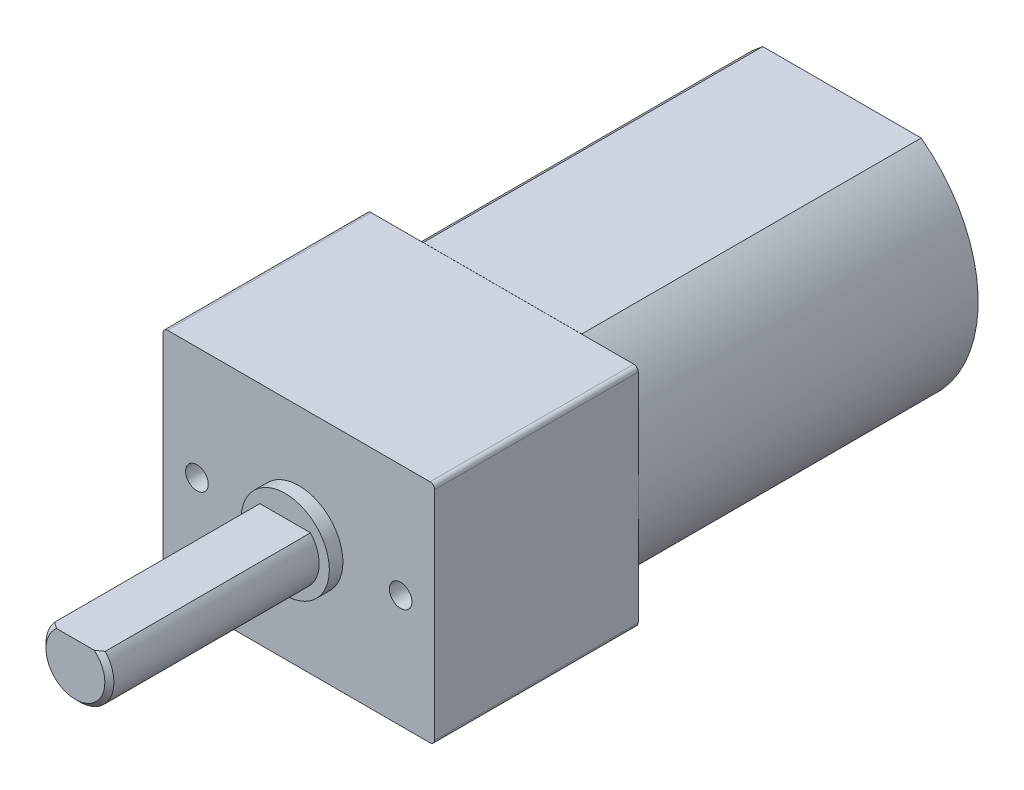
ISO-10303-21;
HEADER;
FILE_DESCRIPTION(('STEP AP214'),'2;1');
FILE_NAME('part.step','',(''),(''),'','','');
FILE_SCHEMA(('AUTOMOTIVE_DESIGN { 1 0 10303 214 1 1 1 1 }'));
ENDSEC;
DATA;
#1=APPLICATION_CONTEXT('core data for automotive mechanical design processes');
#2=APPLICATION_PROTOCOL_DEFINITION('international standard','automotive_design',2000,#1);
#3=PRODUCT_CONTEXT('',#1,'mechanical');
#4=PRODUCT('Part','Part','',(#3));
#5=PRODUCT_RELATED_PRODUCT_CATEGORY('part','',(#4));
#6=PRODUCT_DEFINITION_FORMATION('','',#4);
#7=PRODUCT_DEFINITION_CONTEXT('part definition',#1,'design');
#8=PRODUCT_DEFINITION('design','',#6,#7);
#9=PRODUCT_DEFINITION_SHAPE('','',#8);
#10=(LENGTH_UNIT() NAMED_UNIT(*) SI_UNIT(.MILLI.,.METRE.));
#11=(NAMED_UNIT(*) PLANE_ANGLE_UNIT() SI_UNIT($,.RADIAN.));
#12=(NAMED_UNIT(*) SI_UNIT($,.STERADIAN.) SOLID_ANGLE_UNIT());
#13=UNCERTAINTY_MEASURE_WITH_UNIT(LENGTH_MEASURE(1.E-05),#10,'distance_accuracy_value','');
#14=(GEOMETRIC_REPRESENTATION_CONTEXT(3) GLOBAL_UNCERTAINTY_ASSIGNED_CONTEXT((#13)) GLOBAL_UNIT_ASSIGNED_CONTEXT((#10,
#11,#12)) REPRESENTATION_CONTEXT('',''));
#15=CARTESIAN_POINT('',(0.,0.,0.));
#16=DIRECTION('',(0.,0.,1.));
#17=DIRECTION('',(1.,0.,0.));
#18=AXIS2_PLACEMENT_3D('',#15,#16,#17);
#19=CARTESIAN_POINT('',(-0.202155174491927,0.,15.));
#20=DIRECTION('',(0.,0.,-1.));
#21=DIRECTION('',(-1.,0.,0.));
#22=AXIS2_PLACEMENT_3D('',#19,#20,#21);
#23=PLANE('',#22);
#24=DIRECTION('',(0.,1.,0.));
#25=VECTOR('',#24,1.);
#26=CARTESIAN_POINT('',(6.,-4.995,15.));
#27=LINE('',#26,#25);
#28=CARTESIAN_POINT('',(6.,-0.489105436015966,15.));
#29=VERTEX_POINT('',#28);
#30=CARTESIAN_POINT('',(6.,0.489105436015966,15.));
#31=VERTEX_POINT('',#30);
#32=EDGE_CURVE('E234',#29,#31,#27,.T.);
#33=ORIENTED_EDGE('',*,*,#32,.F.);
#34=CARTESIAN_POINT('',(-0.202155174491927,0.,15.));
#35=DIRECTION('',(0.,0.,1.));
#36=DIRECTION('',(-1.,0.,0.));
#37=AXIS2_PLACEMENT_3D('',#34,#35,#36);
#38=CIRCLE('',#37,6.2214108477111);
#39=EDGE_CURVE('E499',#29,#31,#38,.T.);
#40=ORIENTED_EDGE('',*,*,#39,.T.);
#41=EDGE_LOOP('',(#33,#40));
#42=FACE_BOUND('',#41,.T.);
#43=ADVANCED_FACE('F51',(#42),#23,.F.);
#44=DIRECTION('',(1.,0.,0.));
#45=VECTOR('',#44,1.);
#46=CARTESIAN_POINT('',(-6.,-4.995,15.));
#47=LINE('',#46,#45);
#48=CARTESIAN_POINT('',(-3.50657267520119,-4.995,15.));
#49=VERTEX_POINT('',#48);
#50=CARTESIAN_POINT('',(3.50674330565246,-4.995,15.));
#51=VERTEX_POINT('',#50);
#52=EDGE_CURVE('E246',#49,#51,#47,.T.);
#53=ORIENTED_EDGE('',*,*,#52,.F.);
#54=CARTESIAN_POINT('',(0.298438110226455,0.,15.));
#55=DIRECTION('',(0.,0.,1.));
#56=DIRECTION('',(1.,0.,0.));
#57=AXIS2_PLACEMENT_3D('',#54,#55,#56);
#58=CIRCLE('',#57,6.27918243700728);
#59=CARTESIAN_POINT('',(-3.5,-5.,15.));
#60=VERTEX_POINT('',#59);
#61=EDGE_CURVE('E265',#49,#60,#58,.T.);
#62=ORIENTED_EDGE('',*,*,#61,.T.);
#63=DIRECTION('',(1.,0.,0.));
#64=VECTOR('',#63,1.);
#65=CARTESIAN_POINT('',(-3.5,-5.,15.));
#66=LINE('',#65,#64);
#67=CARTESIAN_POINT('',(3.5,-5.,15.));
#68=VERTEX_POINT('',#67);
#69=EDGE_CURVE('E269',#60,#68,#66,.T.);
#70=ORIENTED_EDGE('',*,*,#69,.T.);
#71=EDGE_CURVE('E256',#68,#51,#38,.T.);
#72=ORIENTED_EDGE('',*,*,#71,.T.);
#73=EDGE_LOOP('',(#53,#62,#70,#72));
#74=FACE_BOUND('',#73,.T.);
#75=ADVANCED_FACE('F419',(#74),#23,.F.);
#76=DIRECTION('',(-1.,0.,0.));
#77=VECTOR('',#76,1.);
#78=CARTESIAN_POINT('',(-6.,4.995,15.));
#79=LINE('',#78,#77);
#80=CARTESIAN_POINT('',(3.50674330565246,4.995,15.));
#81=VERTEX_POINT('',#80);
#82=CARTESIAN_POINT('',(-3.50657267520119,4.995,15.));
#83=VERTEX_POINT('',#82);
#84=EDGE_CURVE('E239',#81,#83,#79,.T.);
#85=ORIENTED_EDGE('',*,*,#84,.F.);
#86=CARTESIAN_POINT('',(3.5,5.,15.));
#87=VERTEX_POINT('',#86);
#88=EDGE_CURVE('E262',#81,#87,#38,.T.);
#89=ORIENTED_EDGE('',*,*,#88,.T.);
#90=DIRECTION('',(-1.,0.,0.));
#91=VECTOR('',#90,1.);
#92=CARTESIAN_POINT('',(-3.5,5.,15.));
#93=LINE('',#92,#91);
#94=CARTESIAN_POINT('',(-3.5,5.,15.));
#95=VERTEX_POINT('',#94);
#96=EDGE_CURVE('E260',#87,#95,#93,.T.);
#97=ORIENTED_EDGE('',*,*,#96,.T.);
#98=EDGE_CURVE('E266',#95,#83,#58,.T.);
#99=ORIENTED_EDGE('',*,*,#98,.T.);
#100=EDGE_LOOP('',(#85,#89,#97,#99));
#101=FACE_BOUND('',#100,.T.);
#102=ADVANCED_FACE('F421',(#101),#23,.F.);
#103=CARTESIAN_POINT('',(-0.202155174491927,0.,15.));
#104=DIRECTION('',(0.,0.,-1.));
#105=DIRECTION('',(-1.,0.,0.));
#106=AXIS2_PLACEMENT_3D('',#103,#104,#105);
#107=CYLINDRICAL_SURFACE('',#106,6.2214108477111);
#108=CARTESIAN_POINT('',(-0.202155174491927,0.,0.));
#109=DIRECTION('',(0.,0.,1.));
#110=DIRECTION('',(-1.,0.,0.));
#111=AXIS2_PLACEMENT_3D('',#108,#109,#110);
#112=CIRCLE('',#111,6.2214108477111);
#113=CARTESIAN_POINT('',(3.5,-5.,0.));
#114=VERTEX_POINT('',#113);
#115=CARTESIAN_POINT('',(3.5,5.,0.));
#116=VERTEX_POINT('',#115);
#117=EDGE_CURVE('E250',#114,#116,#112,.T.);
#118=ORIENTED_EDGE('',*,*,#117,.T.);
#119=DIRECTION('',(0.,0.,-1.));
#120=VECTOR('',#119,1.);
#121=CARTESIAN_POINT('',(3.5,5.,15.));
#122=LINE('',#121,#120);
#123=EDGE_CURVE('E255',#87,#116,#122,.T.);
#124=ORIENTED_EDGE('',*,*,#123,.F.);
#125=ORIENTED_EDGE('',*,*,#88,.F.);
#126=EDGE_CURVE('E497',#31,#81,#38,.T.);
#127=ORIENTED_EDGE('',*,*,#126,.F.);
#128=ORIENTED_EDGE('',*,*,#39,.F.);
#129=EDGE_CURVE('E261',#51,#29,#38,.T.);
#130=ORIENTED_EDGE('',*,*,#129,.F.);
#131=ORIENTED_EDGE('',*,*,#71,.F.);
#132=DIRECTION('',(0.,0.,-1.));
#133=VECTOR('',#132,1.);
#134=CARTESIAN_POINT('',(3.5,-5.,15.));
#135=LINE('',#134,#133);
#136=EDGE_CURVE('E273',#68,#114,#135,.T.);
#137=ORIENTED_EDGE('',*,*,#136,.T.);
#138=EDGE_LOOP('',(#118,#124,#125,#127,#128,#130,#131,#137));
#139=FACE_BOUND('',#138,.T.);
#140=ADVANCED_FACE('F436',(#139),#107,.T.);
#141=CARTESIAN_POINT('',(-3.5,5.,15.));
#142=DIRECTION('',(0.,-1.,0.));
#143=DIRECTION('',(0.,0.,-1.));
#144=AXIS2_PLACEMENT_3D('',#141,#142,#143);
#145=PLANE('',#144);
#146=DIRECTION('',(-1.,0.,0.));
#147=VECTOR('',#146,1.);
#148=CARTESIAN_POINT('',(-3.5,5.,0.));
#149=LINE('',#148,#147);
#150=CARTESIAN_POINT('',(-3.5,5.,0.));
#151=VERTEX_POINT('',#150);
#152=EDGE_CURVE('E277',#116,#151,#149,.T.);
#153=ORIENTED_EDGE('',*,*,#152,.T.);
#154=DIRECTION('',(0.,0.,-1.));
#155=VECTOR('',#154,1.);
#156=CARTESIAN_POINT('',(-3.5,5.,15.));
#157=LINE('',#156,#155);
#158=EDGE_CURVE('E293',#95,#151,#157,.T.);
#159=ORIENTED_EDGE('',*,*,#158,.F.);
#160=ORIENTED_EDGE('',*,*,#96,.F.);
#161=ORIENTED_EDGE('',*,*,#123,.T.);
#162=EDGE_LOOP('',(#153,#159,#160,#161));
#163=FACE_BOUND('',#162,.T.);
#164=ADVANCED_FACE('F432',(#163),#145,.F.);
#165=CARTESIAN_POINT('',(0.298438110226455,0.,15.));
#166=DIRECTION('',(0.,0.,-1.));
#167=DIRECTION('',(-1.,0.,0.));
#168=AXIS2_PLACEMENT_3D('',#165,#166,#167);
#169=CYLINDRICAL_SURFACE('',#168,6.27918243700728);
#170=CARTESIAN_POINT('',(0.298438110226455,0.,0.));
#171=DIRECTION('',(0.,0.,1.));
#172=DIRECTION('',(1.,0.,0.));
#173=AXIS2_PLACEMENT_3D('',#170,#171,#172);
#174=CIRCLE('',#173,6.27918243700728);
#175=CARTESIAN_POINT('',(-3.5,-5.,0.));
#176=VERTEX_POINT('',#175);
#177=EDGE_CURVE('E280',#151,#176,#174,.T.);
#178=ORIENTED_EDGE('',*,*,#177,.T.);
#179=DIRECTION('',(0.,0.,-1.));
#180=VECTOR('',#179,1.);
#181=CARTESIAN_POINT('',(-3.5,-5.,15.));
#182=LINE('',#181,#180);
#183=EDGE_CURVE('E289',#60,#176,#182,.T.);
#184=ORIENTED_EDGE('',*,*,#183,.F.);
#185=ORIENTED_EDGE('',*,*,#61,.F.);
#186=EDGE_CURVE('E270',#83,#49,#58,.T.);
#187=ORIENTED_EDGE('',*,*,#186,.F.);
#188=ORIENTED_EDGE('',*,*,#98,.F.);
#189=ORIENTED_EDGE('',*,*,#158,.T.);
#190=EDGE_LOOP('',(#178,#184,#185,#187,#188,#189));
#191=FACE_BOUND('',#190,.T.);
#192=ADVANCED_FACE('F428',(#191),#169,.T.);
#193=CARTESIAN_POINT('',(-3.5,-5.,15.));
#194=DIRECTION('',(0.,1.,0.));
#195=DIRECTION('',(0.,0.,1.));
#196=AXIS2_PLACEMENT_3D('',#193,#194,#195);
#197=PLANE('',#196);
#198=DIRECTION('',(1.,0.,0.));
#199=VECTOR('',#198,1.);
#200=CARTESIAN_POINT('',(-3.5,-5.,0.));
#201=LINE('',#200,#199);
#202=EDGE_CURVE('E283',#176,#114,#201,.T.);
#203=ORIENTED_EDGE('',*,*,#202,.T.);
#204=ORIENTED_EDGE('',*,*,#136,.F.);
#205=ORIENTED_EDGE('',*,*,#69,.F.);
#206=ORIENTED_EDGE('',*,*,#183,.T.);
#207=EDGE_LOOP('',(#203,#204,#205,#206));
#208=FACE_BOUND('',#207,.T.);
#209=ADVANCED_FACE('F424',(#208),#197,.F.);
#210=CARTESIAN_POINT('',(-0.202155174491927,0.,0.));
#211=DIRECTION('',(0.,0.,-1.));
#212=DIRECTION('',(-1.,0.,0.));
#213=AXIS2_PLACEMENT_3D('',#210,#211,#212);
#214=PLANE('',#213);
#215=CARTESIAN_POINT('',(0.,0.,0.));
#216=DIRECTION('',(0.,0.,-1.));
#217=DIRECTION('',(-1.,0.,0.));
#218=AXIS2_PLACEMENT_3D('',#215,#216,#217);
#219=CIRCLE('',#218,2.5);
#220=CARTESIAN_POINT('',(-2.5,0.,0.));
#221=VERTEX_POINT('',#220);
#222=EDGE_CURVE('E251',#221,#221,#219,.T.);
#223=ORIENTED_EDGE('',*,*,#222,.F.);
#224=EDGE_LOOP('',(#223));
#225=FACE_BOUND('',#224,.T.);
#226=ORIENTED_EDGE('',*,*,#117,.F.);
#227=ORIENTED_EDGE('',*,*,#202,.F.);
#228=ORIENTED_EDGE('',*,*,#177,.F.);
#229=ORIENTED_EDGE('',*,*,#152,.F.);
#230=EDGE_LOOP('',(#226,#227,#228,#229));
#231=FACE_BOUND('',#230,.T.);
#232=ADVANCED_FACE('F415',(#225,#231),#214,.T.);
#233=CARTESIAN_POINT('',(0.,0.,-1.));
#234=DIRECTION('',(0.,0.,1.));
#235=DIRECTION('',(1.,0.,0.));
#236=AXIS2_PLACEMENT_3D('',#233,#234,#235);
#237=CYLINDRICAL_SURFACE('',#236,2.5);
#238=CARTESIAN_POINT('',(0.,0.,-1.));
#239=DIRECTION('',(0.,0.,-1.));
#240=DIRECTION('',(-1.,0.,0.));
#241=AXIS2_PLACEMENT_3D('',#238,#239,#240);
#242=CIRCLE('',#241,2.5);
#243=CARTESIAN_POINT('',(-2.5,0.,-1.));
#244=VERTEX_POINT('',#243);
#245=EDGE_CURVE('E229',#244,#244,#242,.T.);
#246=ORIENTED_EDGE('',*,*,#245,.F.);
#247=EDGE_LOOP('',(#246));
#248=FACE_BOUND('',#247,.T.);
#249=ORIENTED_EDGE('',*,*,#222,.T.);
#250=EDGE_LOOP('',(#249));
#251=FACE_BOUND('',#250,.T.);
#252=ADVANCED_FACE('F411',(#248,#251),#237,.T.);
#253=CARTESIAN_POINT('',(0.,0.,-1.));
#254=DIRECTION('',(0.,0.,-1.));
#255=DIRECTION('',(-1.,0.,0.));
#256=AXIS2_PLACEMENT_3D('',#253,#254,#255);
#257=PLANE('',#256);
#258=ORIENTED_EDGE('',*,*,#245,.T.);
#259=EDGE_LOOP('',(#258));
#260=FACE_BOUND('',#259,.T.);
#261=ADVANCED_FACE('F408',(#260),#257,.T.);
#262=CARTESIAN_POINT('',(0.,0.,15.));
#263=DIRECTION('',(0.,0.,-1.));
#264=DIRECTION('',(-1.,0.,0.));
#265=AXIS2_PLACEMENT_3D('',#262,#263,#264);
#266=PLANE('',#265);
#267=CARTESIAN_POINT('',(6.,-4.795,15.));
#268=VERTEX_POINT('',#267);
#269=EDGE_CURVE('E230',#268,#29,#27,.T.);
#270=ORIENTED_EDGE('',*,*,#269,.F.);
#271=CARTESIAN_POINT('',(5.8,-4.795,15.));
#272=DIRECTION('',(0.,0.,-1.));
#273=DIRECTION('',(-1.,0.,0.));
#274=AXIS2_PLACEMENT_3D('',#271,#272,#273);
#275=CIRCLE('',#274,0.2);
#276=CARTESIAN_POINT('',(5.8,-4.995,15.));
#277=VERTEX_POINT('',#276);
#278=EDGE_CURVE('E307',#268,#277,#275,.T.);
#279=ORIENTED_EDGE('',*,*,#278,.T.);
#280=EDGE_CURVE('E243',#51,#277,#47,.T.);
#281=ORIENTED_EDGE('',*,*,#280,.F.);
#282=ORIENTED_EDGE('',*,*,#129,.T.);
#283=EDGE_LOOP('',(#270,#279,#281,#282));
#284=FACE_BOUND('',#283,.T.);
#285=ADVANCED_FACE('F391',(#284),#266,.T.);
#286=CARTESIAN_POINT('',(5.8,4.995,15.));
#287=VERTEX_POINT('',#286);
#288=EDGE_CURVE('E235',#287,#81,#79,.T.);
#289=ORIENTED_EDGE('',*,*,#288,.F.);
#290=CARTESIAN_POINT('',(5.8,4.795,15.));
#291=DIRECTION('',(0.,0.,-1.));
#292=DIRECTION('',(-1.,0.,0.));
#293=AXIS2_PLACEMENT_3D('',#290,#291,#292);
#294=CIRCLE('',#293,0.2);
#295=CARTESIAN_POINT('',(6.,4.795,15.));
#296=VERTEX_POINT('',#295);
#297=EDGE_CURVE('E211',#287,#296,#294,.T.);
#298=ORIENTED_EDGE('',*,*,#297,.T.);
#299=EDGE_CURVE('E205',#31,#296,#27,.T.);
#300=ORIENTED_EDGE('',*,*,#299,.F.);
#301=ORIENTED_EDGE('',*,*,#126,.T.);
#302=EDGE_LOOP('',(#289,#298,#300,#301));
#303=FACE_BOUND('',#302,.T.);
#304=ADVANCED_FACE('F392',(#303),#266,.T.);
#305=CARTESIAN_POINT('',(6.,-4.995,24.));
#306=DIRECTION('',(-1.,0.,0.));
#307=DIRECTION('',(0.,0.,1.));
#308=AXIS2_PLACEMENT_3D('',#305,#306,#307);
#309=PLANE('',#308);
#310=DIRECTION('',(0.,1.,0.));
#311=VECTOR('',#310,1.);
#312=CARTESIAN_POINT('',(6.,-4.995,24.));
#313=LINE('',#312,#311);
#314=CARTESIAN_POINT('',(6.,-4.795,24.));
#315=VERTEX_POINT('',#314);
#316=CARTESIAN_POINT('',(6.,4.795,24.));
#317=VERTEX_POINT('',#316);
#318=EDGE_CURVE('E212',#315,#317,#313,.T.);
#319=ORIENTED_EDGE('',*,*,#318,.F.);
#320=DIRECTION('',(0.,0.,-1.));
#321=VECTOR('',#320,1.);
#322=CARTESIAN_POINT('',(6.,-4.795,24.));
#323=LINE('',#322,#321);
#324=EDGE_CURVE('E303',#315,#268,#323,.T.);
#325=ORIENTED_EDGE('',*,*,#324,.T.);
#326=ORIENTED_EDGE('',*,*,#269,.T.);
#327=ORIENTED_EDGE('',*,*,#32,.T.);
#328=ORIENTED_EDGE('',*,*,#299,.T.);
#329=DIRECTION('',(0.,0.,-1.));
#330=VECTOR('',#329,1.);
#331=CARTESIAN_POINT('',(6.,4.795,24.));
#332=LINE('',#331,#330);
#333=EDGE_CURVE('E300',#296,#317,#332,.F.);
#334=ORIENTED_EDGE('',*,*,#333,.T.);
#335=EDGE_LOOP('',(#319,#325,#326,#327,#328,#334));
#336=FACE_BOUND('',#335,.T.);
#337=ADVANCED_FACE('F403',(#336),#309,.F.);
#338=CARTESIAN_POINT('',(-6.,4.995,24.));
#339=DIRECTION('',(0.,-1.,0.));
#340=DIRECTION('',(0.,0.,-1.));
#341=AXIS2_PLACEMENT_3D('',#338,#339,#340);
#342=PLANE('',#341);
#343=CARTESIAN_POINT('',(-5.8,4.995,15.));
#344=VERTEX_POINT('',#343);
#345=EDGE_CURVE('E233',#83,#344,#79,.T.);
#346=ORIENTED_EDGE('',*,*,#345,.T.);
#347=DIRECTION('',(0.,0.,-1.));
#348=VECTOR('',#347,1.);
#349=CARTESIAN_POINT('',(-5.8,4.995,24.));
#350=LINE('',#349,#348);
#351=CARTESIAN_POINT('',(-5.8,4.995,24.));
#352=VERTEX_POINT('',#351);
#353=EDGE_CURVE('E346',#344,#352,#350,.F.);
#354=ORIENTED_EDGE('',*,*,#353,.T.);
#355=DIRECTION('',(-1.,0.,0.));
#356=VECTOR('',#355,1.);
#357=CARTESIAN_POINT('',(-6.,4.995,24.));
#358=LINE('',#357,#356);
#359=CARTESIAN_POINT('',(5.8,4.995,24.));
#360=VERTEX_POINT('',#359);
#361=EDGE_CURVE('E216',#360,#352,#358,.T.);
#362=ORIENTED_EDGE('',*,*,#361,.F.);
#363=DIRECTION('',(0.,0.,-1.));
#364=VECTOR('',#363,1.);
#365=CARTESIAN_POINT('',(5.8,4.995,24.));
#366=LINE('',#365,#364);
#367=EDGE_CURVE('E342',#360,#287,#366,.T.);
#368=ORIENTED_EDGE('',*,*,#367,.T.);
#369=ORIENTED_EDGE('',*,*,#288,.T.);
#370=ORIENTED_EDGE('',*,*,#84,.T.);
#371=EDGE_LOOP('',(#346,#354,#362,#368,#369,#370));
#372=FACE_BOUND('',#371,.T.);
#373=ADVANCED_FACE('F399',(#372),#342,.F.);
#374=CARTESIAN_POINT('',(-6.,-4.995,24.));
#375=DIRECTION('',(1.,0.,0.));
#376=DIRECTION('',(0.,0.,-1.));
#377=AXIS2_PLACEMENT_3D('',#374,#375,#376);
#378=PLANE('',#377);
#379=DIRECTION('',(0.,-1.,0.));
#380=VECTOR('',#379,1.);
#381=CARTESIAN_POINT('',(-6.,-4.995,15.));
#382=LINE('',#381,#380);
#383=CARTESIAN_POINT('',(-6.,4.795,15.));
#384=VERTEX_POINT('',#383);
#385=CARTESIAN_POINT('',(-6.,-4.795,15.));
#386=VERTEX_POINT('',#385);
#387=EDGE_CURVE('E238',#384,#386,#382,.T.);
#388=ORIENTED_EDGE('',*,*,#387,.T.);
#389=DIRECTION('',(0.,0.,-1.));
#390=VECTOR('',#389,1.);
#391=CARTESIAN_POINT('',(-6.,-4.795,24.));
#392=LINE('',#391,#390);
#393=CARTESIAN_POINT('',(-6.,-4.795,24.));
#394=VERTEX_POINT('',#393);
#395=EDGE_CURVE('E339',#386,#394,#392,.F.);
#396=ORIENTED_EDGE('',*,*,#395,.T.);
#397=DIRECTION('',(0.,-1.,0.));
#398=VECTOR('',#397,1.);
#399=CARTESIAN_POINT('',(-6.,-4.995,24.));
#400=LINE('',#399,#398);
#401=CARTESIAN_POINT('',(-6.,4.795,24.));
#402=VERTEX_POINT('',#401);
#403=EDGE_CURVE('E221',#402,#394,#400,.T.);
#404=ORIENTED_EDGE('',*,*,#403,.F.);
#405=DIRECTION('',(0.,0.,-1.));
#406=VECTOR('',#405,1.);
#407=CARTESIAN_POINT('',(-6.,4.795,24.));
#408=LINE('',#407,#406);
#409=EDGE_CURVE('E335',#402,#384,#408,.T.);
#410=ORIENTED_EDGE('',*,*,#409,.T.);
#411=EDGE_LOOP('',(#388,#396,#404,#410));
#412=FACE_BOUND('',#411,.T.);
#413=ADVANCED_FACE('F395',(#412),#378,.F.);
#414=CARTESIAN_POINT('',(-6.,-4.995,24.));
#415=DIRECTION('',(0.,1.,0.));
#416=DIRECTION('',(0.,0.,1.));
#417=AXIS2_PLACEMENT_3D('',#414,#415,#416);
#418=PLANE('',#417);
#419=ORIENTED_EDGE('',*,*,#280,.T.);
#420=DIRECTION('',(0.,0.,-1.));
#421=VECTOR('',#420,1.);
#422=CARTESIAN_POINT('',(5.8,-4.995,24.));
#423=LINE('',#422,#421);
#424=CARTESIAN_POINT('',(5.8,-4.995,24.));
#425=VERTEX_POINT('',#424);
#426=EDGE_CURVE('E314',#277,#425,#423,.F.);
#427=ORIENTED_EDGE('',*,*,#426,.T.);
#428=DIRECTION('',(1.,0.,0.));
#429=VECTOR('',#428,1.);
#430=CARTESIAN_POINT('',(-6.,-4.995,24.));
#431=LINE('',#430,#429);
#432=CARTESIAN_POINT('',(-5.8,-4.995,24.));
#433=VERTEX_POINT('',#432);
#434=EDGE_CURVE('E225',#433,#425,#431,.T.);
#435=ORIENTED_EDGE('',*,*,#434,.F.);
#436=DIRECTION('',(0.,0.,-1.));
#437=VECTOR('',#436,1.);
#438=CARTESIAN_POINT('',(-5.8,-4.995,24.));
#439=LINE('',#438,#437);
#440=CARTESIAN_POINT('',(-5.8,-4.995,15.));
#441=VERTEX_POINT('',#440);
#442=EDGE_CURVE('E310',#433,#441,#439,.T.);
#443=ORIENTED_EDGE('',*,*,#442,.T.);
#444=EDGE_CURVE('E217',#441,#49,#47,.T.);
#445=ORIENTED_EDGE('',*,*,#444,.T.);
#446=ORIENTED_EDGE('',*,*,#52,.T.);
#447=EDGE_LOOP('',(#419,#427,#435,#443,#445,#446));
#448=FACE_BOUND('',#447,.T.);
#449=ADVANCED_FACE('F385',(#448),#418,.F.);
#450=CARTESIAN_POINT('',(0.,0.,24.));
#451=DIRECTION('',(0.,0.,-1.));
#452=DIRECTION('',(-1.,0.,0.));
#453=AXIS2_PLACEMENT_3D('',#450,#451,#452);
#454=PLANE('',#453);
#455=CARTESIAN_POINT('',(-4.5,0.,24.));
#456=DIRECTION('',(0.,0.,1.));
#457=DIRECTION('',(1.,0.,0.));
#458=AXIS2_PLACEMENT_3D('',#455,#456,#457);
#459=CIRCLE('',#458,0.5);
#460=CARTESIAN_POINT('',(-4.,0.,24.));
#461=VERTEX_POINT('',#460);
#462=EDGE_CURVE('E807',#461,#461,#459,.T.);
#463=ORIENTED_EDGE('',*,*,#462,.F.);
#464=EDGE_LOOP('',(#463));
#465=FACE_BOUND('',#464,.T.);
#466=CARTESIAN_POINT('',(4.5,0.,24.));
#467=DIRECTION('',(0.,0.,1.));
#468=DIRECTION('',(1.,0.,0.));
#469=AXIS2_PLACEMENT_3D('',#466,#467,#468);
#470=CIRCLE('',#469,0.500000000000001);
#471=CARTESIAN_POINT('',(5.,0.,24.));
#472=VERTEX_POINT('',#471);
#473=EDGE_CURVE('E811',#472,#472,#470,.T.);
#474=ORIENTED_EDGE('',*,*,#473,.F.);
#475=EDGE_LOOP('',(#474));
#476=FACE_BOUND('',#475,.T.);
#477=CARTESIAN_POINT('',(0.,0.,24.));
#478=DIRECTION('',(0.,0.,1.));
#479=DIRECTION('',(1.,0.,0.));
#480=AXIS2_PLACEMENT_3D('',#477,#478,#479);
#481=CIRCLE('',#480,1.95);
#482=CARTESIAN_POINT('',(1.95,0.,24.));
#483=VERTEX_POINT('',#482);
#484=EDGE_CURVE('E206',#483,#483,#481,.T.);
#485=ORIENTED_EDGE('',*,*,#484,.F.);
#486=EDGE_LOOP('',(#485));
#487=FACE_BOUND('',#486,.T.);
#488=ORIENTED_EDGE('',*,*,#434,.T.);
#489=CARTESIAN_POINT('',(5.8,-4.795,24.));
#490=DIRECTION('',(0.,0.,-1.));
#491=DIRECTION('',(-1.,0.,0.));
#492=AXIS2_PLACEMENT_3D('',#489,#490,#491);
#493=CIRCLE('',#492,0.2);
#494=EDGE_CURVE('E326',#425,#315,#493,.F.);
#495=ORIENTED_EDGE('',*,*,#494,.T.);
#496=ORIENTED_EDGE('',*,*,#318,.T.);
#497=CARTESIAN_POINT('',(5.8,4.795,24.));
#498=DIRECTION('',(0.,0.,-1.));
#499=DIRECTION('',(-1.,0.,0.));
#500=AXIS2_PLACEMENT_3D('',#497,#498,#499);
#501=CIRCLE('',#500,0.2);
#502=EDGE_CURVE('E317',#317,#360,#501,.F.);
#503=ORIENTED_EDGE('',*,*,#502,.T.);
#504=ORIENTED_EDGE('',*,*,#361,.T.);
#505=CARTESIAN_POINT('',(-5.8,4.795,24.));
#506=DIRECTION('',(0.,0.,-1.));
#507=DIRECTION('',(-1.,0.,0.));
#508=AXIS2_PLACEMENT_3D('',#505,#506,#507);
#509=CIRCLE('',#508,0.2);
#510=EDGE_CURVE('E320',#352,#402,#509,.F.);
#511=ORIENTED_EDGE('',*,*,#510,.T.);
#512=ORIENTED_EDGE('',*,*,#403,.T.);
#513=CARTESIAN_POINT('',(-5.8,-4.795,24.));
#514=DIRECTION('',(0.,0.,-1.));
#515=DIRECTION('',(-1.,0.,0.));
#516=AXIS2_PLACEMENT_3D('',#513,#514,#515);
#517=CIRCLE('',#516,0.2);
#518=EDGE_CURVE('E323',#394,#433,#517,.F.);
#519=ORIENTED_EDGE('',*,*,#518,.T.);
#520=EDGE_LOOP('',(#488,#495,#496,#503,#504,#511,#512,#519));
#521=FACE_BOUND('',#520,.T.);
#522=ADVANCED_FACE('F381',(#465,#476,#487,#521),#454,.F.);
#523=ORIENTED_EDGE('',*,*,#444,.F.);
#524=CARTESIAN_POINT('',(-5.8,-4.795,15.));
#525=DIRECTION('',(0.,0.,-1.));
#526=DIRECTION('',(-1.,0.,0.));
#527=AXIS2_PLACEMENT_3D('',#524,#525,#526);
#528=CIRCLE('',#527,0.2);
#529=EDGE_CURVE('E332',#441,#386,#528,.T.);
#530=ORIENTED_EDGE('',*,*,#529,.T.);
#531=ORIENTED_EDGE('',*,*,#387,.F.);
#532=CARTESIAN_POINT('',(-5.8,4.795,15.));
#533=DIRECTION('',(0.,0.,-1.));
#534=DIRECTION('',(-1.,0.,0.));
#535=AXIS2_PLACEMENT_3D('',#532,#533,#534);
#536=CIRCLE('',#535,0.2);
#537=EDGE_CURVE('E329',#384,#344,#536,.T.);
#538=ORIENTED_EDGE('',*,*,#537,.T.);
#539=ORIENTED_EDGE('',*,*,#345,.F.);
#540=ORIENTED_EDGE('',*,*,#186,.T.);
#541=EDGE_LOOP('',(#523,#530,#531,#538,#539,#540));
#542=FACE_BOUND('',#541,.T.);
#543=ADVANCED_FACE('F384',(#542),#266,.T.);
#544=CARTESIAN_POINT('',(5.8,-4.795,24.));
#545=DIRECTION('',(0.,0.,-1.));
#546=DIRECTION('',(-1.,0.,0.));
#547=AXIS2_PLACEMENT_3D('',#544,#545,#546);
#548=CYLINDRICAL_SURFACE('',#547,0.2);
#549=ORIENTED_EDGE('',*,*,#494,.F.);
#550=ORIENTED_EDGE('',*,*,#426,.F.);
#551=ORIENTED_EDGE('',*,*,#278,.F.);
#552=ORIENTED_EDGE('',*,*,#324,.F.);
#553=EDGE_LOOP('',(#549,#550,#551,#552));
#554=FACE_BOUND('',#553,.T.);
#555=ADVANCED_FACE('F389',(#554),#548,.T.);
#556=CARTESIAN_POINT('',(-5.8,-4.795,24.));
#557=DIRECTION('',(0.,0.,-1.));
#558=DIRECTION('',(-1.,0.,0.));
#559=AXIS2_PLACEMENT_3D('',#556,#557,#558);
#560=CYLINDRICAL_SURFACE('',#559,0.2);
#561=ORIENTED_EDGE('',*,*,#518,.F.);
#562=ORIENTED_EDGE('',*,*,#395,.F.);
#563=ORIENTED_EDGE('',*,*,#529,.F.);
#564=ORIENTED_EDGE('',*,*,#442,.F.);
#565=EDGE_LOOP('',(#561,#562,#563,#564));
#566=FACE_BOUND('',#565,.T.);
#567=ADVANCED_FACE('F443',(#566),#560,.T.);
#568=CARTESIAN_POINT('',(-5.8,4.795,24.));
#569=DIRECTION('',(0.,0.,-1.));
#570=DIRECTION('',(-1.,0.,0.));
#571=AXIS2_PLACEMENT_3D('',#568,#569,#570);
#572=CYLINDRICAL_SURFACE('',#571,0.2);
#573=ORIENTED_EDGE('',*,*,#510,.F.);
#574=ORIENTED_EDGE('',*,*,#353,.F.);
#575=ORIENTED_EDGE('',*,*,#537,.F.);
#576=ORIENTED_EDGE('',*,*,#409,.F.);
#577=EDGE_LOOP('',(#573,#574,#575,#576));
#578=FACE_BOUND('',#577,.T.);
#579=ADVANCED_FACE('F447',(#578),#572,.T.);
#580=CARTESIAN_POINT('',(5.8,4.795,24.));
#581=DIRECTION('',(0.,0.,-1.));
#582=DIRECTION('',(-1.,0.,0.));
#583=AXIS2_PLACEMENT_3D('',#580,#581,#582);
#584=CYLINDRICAL_SURFACE('',#583,0.2);
#585=ORIENTED_EDGE('',*,*,#502,.F.);
#586=ORIENTED_EDGE('',*,*,#333,.F.);
#587=ORIENTED_EDGE('',*,*,#297,.F.);
#588=ORIENTED_EDGE('',*,*,#367,.F.);
#589=EDGE_LOOP('',(#585,#586,#587,#588));
#590=FACE_BOUND('',#589,.T.);
#591=ADVANCED_FACE('F379',(#590),#584,.T.);
#592=CARTESIAN_POINT('',(0.,0.,24.6));
#593=DIRECTION('',(0.,0.,-1.));
#594=DIRECTION('',(-1.,0.,0.));
#595=AXIS2_PLACEMENT_3D('',#592,#593,#594);
#596=CYLINDRICAL_SURFACE('',#595,1.95);
#597=CARTESIAN_POINT('',(0.,0.,24.6));
#598=DIRECTION('',(0.,0.,1.));
#599=DIRECTION('',(1.,0.,0.));
#600=AXIS2_PLACEMENT_3D('',#597,#598,#599);
#601=CIRCLE('',#600,1.95);
#602=CARTESIAN_POINT('',(1.95,0.,24.6));
#603=VERTEX_POINT('',#602);
#604=EDGE_CURVE('E201',#603,#603,#601,.T.);
#605=ORIENTED_EDGE('',*,*,#604,.F.);
#606=EDGE_LOOP('',(#605));
#607=FACE_BOUND('',#606,.T.);
#608=ORIENTED_EDGE('',*,*,#484,.T.);
#609=EDGE_LOOP('',(#608));
#610=FACE_BOUND('',#609,.T.);
#611=ADVANCED_FACE('F376',(#607,#610),#596,.T.);
#612=CARTESIAN_POINT('',(0.,0.,24.6));
#613=DIRECTION('',(0.,0.,1.));
#614=DIRECTION('',(1.,0.,0.));
#615=AXIS2_PLACEMENT_3D('',#612,#613,#614);
#616=PLANE('',#615);
#617=CARTESIAN_POINT('',(0.,0.,24.6));
#618=DIRECTION('',(0.,0.,1.));
#619=DIRECTION('',(1.,0.,0.));
#620=AXIS2_PLACEMENT_3D('',#617,#618,#619);
#621=CIRCLE('',#620,1.5);
#622=CARTESIAN_POINT('',(-1.1180339887499,1.,24.6));
#623=VERTEX_POINT('',#622);
#624=CARTESIAN_POINT('',(1.1180339887499,1.,24.6));
#625=VERTEX_POINT('',#624);
#626=EDGE_CURVE('E177',#623,#625,#621,.T.);
#627=ORIENTED_EDGE('',*,*,#626,.F.);
#628=DIRECTION('',(-1.,0.,0.));
#629=VECTOR('',#628,1.);
#630=CARTESIAN_POINT('',(-1.1180339887499,1.,24.6));
#631=LINE('',#630,#629);
#632=EDGE_CURVE('E188',#625,#623,#631,.T.);
#633=ORIENTED_EDGE('',*,*,#632,.F.);
#634=EDGE_LOOP('',(#627,#633));
#635=FACE_BOUND('',#634,.T.);
#636=ORIENTED_EDGE('',*,*,#604,.T.);
#637=EDGE_LOOP('',(#636));
#638=FACE_BOUND('',#637,.T.);
#639=ADVANCED_FACE('F186',(#635,#638),#616,.T.);
#640=CARTESIAN_POINT('',(0.,0.,33.87));
#641=DIRECTION('',(0.,0.,-1.));
#642=DIRECTION('',(-1.,0.,0.));
#643=AXIS2_PLACEMENT_3D('',#640,#641,#642);
#644=CYLINDRICAL_SURFACE('',#643,1.5);
#645=DIRECTION('',(0.,0.,-1.));
#646=VECTOR('',#645,1.);
#647=CARTESIAN_POINT('',(1.1180339887499,1.,33.87));
#648=LINE('',#647,#646);
#649=CARTESIAN_POINT('',(1.1180339887499,1.,33.67));
#650=VERTEX_POINT('',#649);
#651=EDGE_CURVE('E181',#650,#625,#648,.T.);
#652=ORIENTED_EDGE('',*,*,#651,.F.);
#653=CARTESIAN_POINT('',(0.,0.,33.67));
#654=DIRECTION('',(0.,0.,1.));
#655=DIRECTION('',(1.,0.,0.));
#656=AXIS2_PLACEMENT_3D('',#653,#654,#655);
#657=CIRCLE('',#656,1.5);
#658=CARTESIAN_POINT('',(-1.1180339887499,1.,33.67));
#659=VERTEX_POINT('',#658);
#660=EDGE_CURVE('E11',#650,#659,#657,.F.);
#661=ORIENTED_EDGE('',*,*,#660,.T.);
#662=DIRECTION('',(0.,0.,-1.));
#663=VECTOR('',#662,1.);
#664=CARTESIAN_POINT('',(-1.1180339887499,1.,33.87));
#665=LINE('',#664,#663);
#666=EDGE_CURVE('E174',#659,#623,#665,.T.);
#667=ORIENTED_EDGE('',*,*,#666,.T.);
#668=ORIENTED_EDGE('',*,*,#626,.T.);
#669=EDGE_LOOP('',(#652,#661,#667,#668));
#670=FACE_BOUND('',#669,.T.);
#671=ADVANCED_FACE('F176',(#670),#644,.T.);
#672=CARTESIAN_POINT('',(-1.1180339887499,1.,33.87));
#673=DIRECTION('',(0.,-1.,0.));
#674=DIRECTION('',(0.,0.,-1.));
#675=AXIS2_PLACEMENT_3D('',#672,#673,#674);
#676=PLANE('',#675);
#677=DIRECTION('',(-1.,0.,0.));
#678=VECTOR('',#677,1.);
#679=CARTESIAN_POINT('',(-1.1180339887499,1.,33.87));
#680=LINE('',#679,#678);
#681=CARTESIAN_POINT('',(0.830662386291812,1.,33.87));
#682=VERTEX_POINT('',#681);
#683=CARTESIAN_POINT('',(-0.830662386291812,1.,33.87));
#684=VERTEX_POINT('',#683);
#685=EDGE_CURVE('E182',#682,#684,#680,.T.);
#686=ORIENTED_EDGE('',*,*,#685,.F.);
#687=CARTESIAN_POINT('',(0.830662386291812,1.,33.87));
#688=CARTESIAN_POINT('',(0.855257911379643,1.,33.8542808530586));
#689=CARTESIAN_POINT('',(0.879667402474999,1.,33.8382742367266));
#690=CARTESIAN_POINT('',(0.928145185161169,1.,33.8057683556218));
#691=CARTESIAN_POINT('',(0.952213583154995,1.,33.7892692497011));
#692=CARTESIAN_POINT('',(1.00005405944847,1.,33.755851692394));
#693=CARTESIAN_POINT('',(1.02382615792588,1.,33.7389332697999));
#694=CARTESIAN_POINT('',(1.07111532708974,1.,33.7047276928988));
#695=CARTESIAN_POINT('',(1.09463231405636,1.,33.6874404227584));
#696=CARTESIAN_POINT('',(1.1180339887499,1.,33.67));
#697=B_SPLINE_CURVE_WITH_KNOTS('',3,(#687,#688,#689,#690,#691,#692,#693,#694,#695,#696),
.UNSPECIFIED.,.F.,.F.,(4,2,2,2,4),(0.,0.0875639286557428,0.175099912504186,0.262629902288721,
0.350187796934934),.UNSPECIFIED.);
#698=EDGE_CURVE('E62',#682,#650,#697,.T.);
#699=ORIENTED_EDGE('',*,*,#698,.T.);
#700=ORIENTED_EDGE('',*,*,#651,.T.);
#701=ORIENTED_EDGE('',*,*,#632,.T.);
#702=ORIENTED_EDGE('',*,*,#666,.F.);
#703=CARTESIAN_POINT('',(-1.1180339887499,1.,33.67));
#704=CARTESIAN_POINT('',(-1.09463231405636,1.,33.6874404227584));
#705=CARTESIAN_POINT('',(-1.07111532708974,1.,33.7047276928988));
#706=CARTESIAN_POINT('',(-1.02382615792588,1.,33.7389332697999));
#707=CARTESIAN_POINT('',(-1.00005405944847,1.,33.755851692394));
#708=CARTESIAN_POINT('',(-0.952213583154995,1.,33.7892692497011));
#709=CARTESIAN_POINT('',(-0.928145185161169,1.,33.8057683556218));
#710=CARTESIAN_POINT('',(-0.879667402475,1.,33.8382742367266));
#711=CARTESIAN_POINT('',(-0.855257911379644,1.,33.8542808530586));
#712=CARTESIAN_POINT('',(-0.830662386291813,1.,33.87));
#713=B_SPLINE_CURVE_WITH_KNOTS('',3,(#703,#704,#705,#706,#707,#708,#709,#710,#711,#712),
.UNSPECIFIED.,.F.,.F.,(4,2,2,2,4),(0.,0.0875578946462214,0.175087884430747,0.26262386827919,
0.350187796934932),.UNSPECIFIED.);
#714=EDGE_CURVE('E354',#659,#684,#713,.T.);
#715=ORIENTED_EDGE('',*,*,#714,.T.);
#716=EDGE_LOOP('',(#686,#699,#700,#701,#702,#715));
#717=FACE_BOUND('',#716,.T.);
#718=ADVANCED_FACE('F192',(#717),#676,.F.);
#719=CARTESIAN_POINT('',(0.,0.,33.87));
#720=DIRECTION('',(0.,0.,1.));
#721=DIRECTION('',(1.,0.,0.));
#722=AXIS2_PLACEMENT_3D('',#719,#720,#721);
#723=PLANE('',#722);
#724=ORIENTED_EDGE('',*,*,#685,.T.);
#725=CARTESIAN_POINT('',(0.,0.,33.87));
#726=DIRECTION('',(0.,0.,1.));
#727=DIRECTION('',(1.,0.,0.));
#728=AXIS2_PLACEMENT_3D('',#725,#726,#727);
#729=CIRCLE('',#728,1.3);
#730=EDGE_CURVE('E210',#684,#682,#729,.T.);
#731=ORIENTED_EDGE('',*,*,#730,.T.);
#732=EDGE_LOOP('',(#724,#731));
#733=FACE_BOUND('',#732,.T.);
#734=ADVANCED_FACE('F369',(#733),#723,.T.);
#735=CARTESIAN_POINT('',(0.,0.,33.87));
#736=DIRECTION('',(0.,0.,-1.));
#737=DIRECTION('',(-1.,0.,0.));
#738=AXIS2_PLACEMENT_3D('',#735,#736,#737);
#739=CONICAL_SURFACE('',#738,1.3,0.785398163397446);
#740=ORIENTED_EDGE('',*,*,#714,.F.);
#741=ORIENTED_EDGE('',*,*,#660,.F.);
#742=ORIENTED_EDGE('',*,*,#698,.F.);
#743=ORIENTED_EDGE('',*,*,#730,.F.);
#744=EDGE_LOOP('',(#740,#741,#742,#743));
#745=FACE_BOUND('',#744,.T.);
#746=ADVANCED_FACE('F54',(#745),#739,.T.);
#747=CARTESIAN_POINT('',(4.5,0.,22.));
#748=DIRECTION('',(0.,0.,1.));
#749=DIRECTION('',(1.,0.,0.));
#750=AXIS2_PLACEMENT_3D('',#747,#748,#749);
#751=CYLINDRICAL_SURFACE('',#750,0.500000000000001);
#752=CARTESIAN_POINT('',(4.5,0.,22.));
#753=DIRECTION('',(0.,0.,1.));
#754=DIRECTION('',(1.,0.,0.));
#755=AXIS2_PLACEMENT_3D('',#752,#753,#754);
#756=CIRCLE('',#755,0.500000000000001);
#757=CARTESIAN_POINT('',(5.,0.,22.));
#758=VERTEX_POINT('',#757);
#759=EDGE_CURVE('E817',#758,#758,#756,.T.);
#760=ORIENTED_EDGE('',*,*,#759,.F.);
#761=EDGE_LOOP('',(#760));
#762=FACE_BOUND('',#761,.T.);
#763=ORIENTED_EDGE('',*,*,#473,.T.);
#764=EDGE_LOOP('',(#763));
#765=FACE_BOUND('',#764,.T.);
#766=ADVANCED_FACE('F715',(#762,#765),#751,.F.);
#767=CARTESIAN_POINT('',(4.5,0.,22.));
#768=DIRECTION('',(0.,0.,1.));
#769=DIRECTION('',(1.,0.,0.));
#770=AXIS2_PLACEMENT_3D('',#767,#768,#769);
#771=PLANE('',#770);
#772=ORIENTED_EDGE('',*,*,#759,.T.);
#773=EDGE_LOOP('',(#772));
#774=FACE_BOUND('',#773,.T.);
#775=ADVANCED_FACE('F732',(#774),#771,.T.);
#776=CARTESIAN_POINT('',(-4.5,0.,22.));
#777=DIRECTION('',(0.,0.,1.));
#778=DIRECTION('',(1.,0.,0.));
#779=AXIS2_PLACEMENT_3D('',#776,#777,#778);
#780=CYLINDRICAL_SURFACE('',#779,0.5);
#781=CARTESIAN_POINT('',(-4.5,0.,22.));
#782=DIRECTION('',(0.,0.,1.));
#783=DIRECTION('',(1.,0.,0.));
#784=AXIS2_PLACEMENT_3D('',#781,#782,#783);
#785=CIRCLE('',#784,0.5);
#786=CARTESIAN_POINT('',(-4.,0.,22.));
#787=VERTEX_POINT('',#786);
#788=EDGE_CURVE('E190',#787,#787,#785,.T.);
#789=ORIENTED_EDGE('',*,*,#788,.F.);
#790=EDGE_LOOP('',(#789));
#791=FACE_BOUND('',#790,.T.);
#792=ORIENTED_EDGE('',*,*,#462,.T.);
#793=EDGE_LOOP('',(#792));
#794=FACE_BOUND('',#793,.T.);
#795=ADVANCED_FACE('F744',(#791,#794),#780,.F.);
#796=CARTESIAN_POINT('',(-4.5,0.,22.));
#797=DIRECTION('',(0.,0.,1.));
#798=DIRECTION('',(1.,0.,0.));
#799=AXIS2_PLACEMENT_3D('',#796,#797,#798);
#800=PLANE('',#799);
#801=ORIENTED_EDGE('',*,*,#788,.T.);
#802=EDGE_LOOP('',(#801));
#803=FACE_BOUND('',#802,.T.);
#804=ADVANCED_FACE('F755',(#803),#800,.T.);
#805=CLOSED_SHELL('',(#43,#75,#102,#140,#164,#192,#209,#232,#252,#261,#285,#304,#337,#373,#413,
#449,#522,#543,#555,#567,#579,#591,#611,#639,#671,#718,#734,#746,#766,#775,#795,#804));
#806=MANIFOLD_SOLID_BREP('B2',#805);
#807=ADVANCED_BREP_SHAPE_REPRESENTATION('',(#18,#806),#14);
#808=SHAPE_DEFINITION_REPRESENTATION(#9,#807);
ENDSEC;
END-ISO-10303-21;
